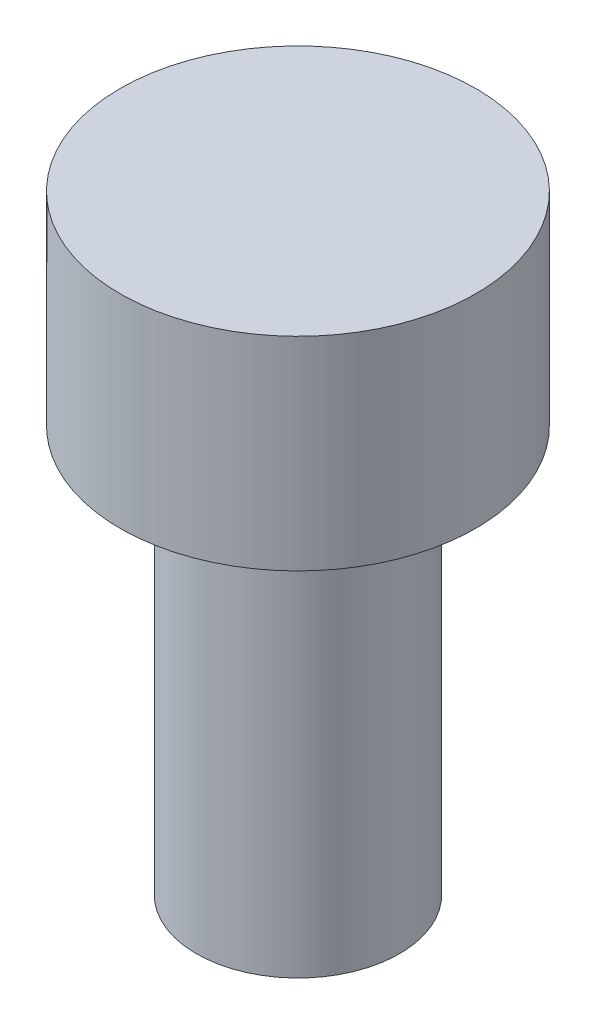
ISO-10303-21;
HEADER;
FILE_DESCRIPTION(('STEP AP214'),'2;1');
FILE_NAME('part.step','',(''),(''),'','','');
FILE_SCHEMA(('AUTOMOTIVE_DESIGN { 1 0 10303 214 1 1 1 1 }'));
ENDSEC;
DATA;
#1=APPLICATION_CONTEXT('core data for automotive mechanical design processes');
#2=APPLICATION_PROTOCOL_DEFINITION('international standard','automotive_design',2000,#1);
#3=PRODUCT_CONTEXT('',#1,'mechanical');
#4=PRODUCT('Part','Part','',(#3));
#5=PRODUCT_RELATED_PRODUCT_CATEGORY('part','',(#4));
#6=PRODUCT_DEFINITION_FORMATION('','',#4);
#7=PRODUCT_DEFINITION_CONTEXT('part definition',#1,'design');
#8=PRODUCT_DEFINITION('design','',#6,#7);
#9=PRODUCT_DEFINITION_SHAPE('','',#8);
#10=(LENGTH_UNIT() NAMED_UNIT(*) SI_UNIT(.MILLI.,.METRE.));
#11=(NAMED_UNIT(*) PLANE_ANGLE_UNIT() SI_UNIT($,.RADIAN.));
#12=(NAMED_UNIT(*) SI_UNIT($,.STERADIAN.) SOLID_ANGLE_UNIT());
#13=UNCERTAINTY_MEASURE_WITH_UNIT(LENGTH_MEASURE(1.E-05),#10,'distance_accuracy_value','');
#14=(GEOMETRIC_REPRESENTATION_CONTEXT(3) GLOBAL_UNCERTAINTY_ASSIGNED_CONTEXT((#13)) GLOBAL_UNIT_ASSIGNED_CONTEXT((#10,
#11,#12)) REPRESENTATION_CONTEXT('',''));
#15=CARTESIAN_POINT('',(0.,0.,0.));
#16=DIRECTION('',(0.,0.,1.));
#17=DIRECTION('',(1.,0.,0.));
#18=AXIS2_PLACEMENT_3D('',#15,#16,#17);
#19=CARTESIAN_POINT('',(3.5,12.,0.));
#20=DIRECTION('',(0.,-1.,0.));
#21=DIRECTION('',(1.,0.,0.));
#22=AXIS2_PLACEMENT_3D('',#19,#20,#21);
#23=PLANE('',#22);
#24=CARTESIAN_POINT('',(0.,12.,0.));
#25=DIRECTION('',(0.,1.,0.));
#26=DIRECTION('',(-1.,0.,0.));
#27=AXIS2_PLACEMENT_3D('',#24,#25,#26);
#28=CIRCLE('',#27,3.5);
#29=CARTESIAN_POINT('',(-3.5,12.,0.));
#30=VERTEX_POINT('',#29);
#31=EDGE_CURVE('E45',#30,#30,#28,.T.);
#32=ORIENTED_EDGE('',*,*,#31,.T.);
#33=EDGE_LOOP('',(#32));
#34=FACE_BOUND('',#33,.T.);
#35=ADVANCED_FACE('F31',(#34),#23,.F.);
#36=CARTESIAN_POINT('',(0.,0.,0.));
#37=DIRECTION('',(0.,1.,0.));
#38=DIRECTION('',(-1.,0.,0.));
#39=AXIS2_PLACEMENT_3D('',#36,#37,#38);
#40=PLANE('',#39);
#41=CARTESIAN_POINT('',(0.,0.,0.));
#42=DIRECTION('',(0.,1.,0.));
#43=DIRECTION('',(-1.,0.,0.));
#44=AXIS2_PLACEMENT_3D('',#41,#42,#43);
#45=CIRCLE('',#44,2.);
#46=CARTESIAN_POINT('',(-2.,0.,0.));
#47=VERTEX_POINT('',#46);
#48=EDGE_CURVE('E10',#47,#47,#45,.T.);
#49=ORIENTED_EDGE('',*,*,#48,.F.);
#50=EDGE_LOOP('',(#49));
#51=FACE_BOUND('',#50,.T.);
#52=ADVANCED_FACE('F65',(#51),#40,.F.);
#53=CARTESIAN_POINT('',(0.,12.,0.));
#54=DIRECTION('',(0.,1.,0.));
#55=DIRECTION('',(-1.,0.,0.));
#56=AXIS2_PLACEMENT_3D('',#53,#54,#55);
#57=CYLINDRICAL_SURFACE('',#56,2.);
#58=CARTESIAN_POINT('',(0.,8.,0.));
#59=DIRECTION('',(0.,1.,0.));
#60=DIRECTION('',(-1.,0.,0.));
#61=AXIS2_PLACEMENT_3D('',#58,#59,#60);
#62=CIRCLE('',#61,2.);
#63=CARTESIAN_POINT('',(-2.,8.,0.));
#64=VERTEX_POINT('',#63);
#65=EDGE_CURVE('E37',#64,#64,#62,.T.);
#66=ORIENTED_EDGE('',*,*,#65,.F.);
#67=EDGE_LOOP('',(#66));
#68=FACE_BOUND('',#67,.T.);
#69=ORIENTED_EDGE('',*,*,#48,.T.);
#70=EDGE_LOOP('',(#69));
#71=FACE_BOUND('',#70,.T.);
#72=ADVANCED_FACE('F60',(#68,#71),#57,.T.);
#73=CARTESIAN_POINT('',(2.,8.,0.));
#74=DIRECTION('',(0.,1.,0.));
#75=DIRECTION('',(-1.,0.,0.));
#76=AXIS2_PLACEMENT_3D('',#73,#74,#75);
#77=PLANE('',#76);
#78=CARTESIAN_POINT('',(0.,8.,0.));
#79=DIRECTION('',(0.,1.,0.));
#80=DIRECTION('',(-1.,0.,0.));
#81=AXIS2_PLACEMENT_3D('',#78,#79,#80);
#82=CIRCLE('',#81,3.5);
#83=CARTESIAN_POINT('',(-3.5,8.,0.));
#84=VERTEX_POINT('',#83);
#85=EDGE_CURVE('E41',#84,#84,#82,.T.);
#86=ORIENTED_EDGE('',*,*,#85,.F.);
#87=EDGE_LOOP('',(#86));
#88=FACE_BOUND('',#87,.T.);
#89=ORIENTED_EDGE('',*,*,#65,.T.);
#90=EDGE_LOOP('',(#89));
#91=FACE_BOUND('',#90,.T.);
#92=ADVANCED_FACE('F55',(#88,#91),#77,.F.);
#93=CARTESIAN_POINT('',(0.,12.,0.));
#94=DIRECTION('',(0.,1.,0.));
#95=DIRECTION('',(-1.,0.,0.));
#96=AXIS2_PLACEMENT_3D('',#93,#94,#95);
#97=CYLINDRICAL_SURFACE('',#96,3.5);
#98=ORIENTED_EDGE('',*,*,#31,.F.);
#99=EDGE_LOOP('',(#98));
#100=FACE_BOUND('',#99,.T.);
#101=ORIENTED_EDGE('',*,*,#85,.T.);
#102=EDGE_LOOP('',(#101));
#103=FACE_BOUND('',#102,.T.);
#104=ADVANCED_FACE('F52',(#100,#103),#97,.T.);
#105=CLOSED_SHELL('',(#35,#52,#72,#92,#104));
#106=MANIFOLD_SOLID_BREP('B2',#105);
#107=ADVANCED_BREP_SHAPE_REPRESENTATION('',(#18,#106),#14);
#108=SHAPE_DEFINITION_REPRESENTATION(#9,#107);
ENDSEC;
END-ISO-10303-21;
